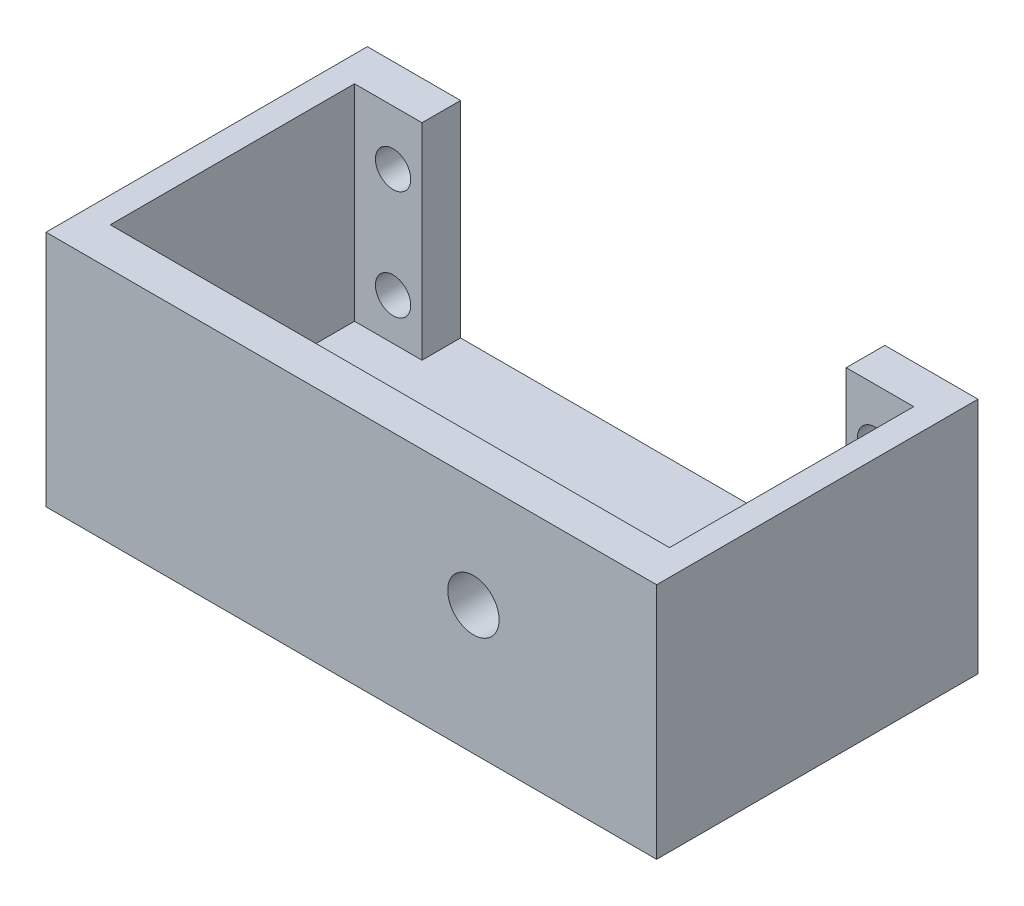
ISO-10303-21;
HEADER;
FILE_DESCRIPTION(('STEP AP214'),'2;1');
FILE_NAME('part.step','',(''),(''),'','','');
FILE_SCHEMA(('AUTOMOTIVE_DESIGN { 1 0 10303 214 1 1 1 1 }'));
ENDSEC;
DATA;
#1=APPLICATION_CONTEXT('core data for automotive mechanical design processes');
#2=APPLICATION_PROTOCOL_DEFINITION('international standard','automotive_design',2000,#1);
#3=PRODUCT_CONTEXT('',#1,'mechanical');
#4=PRODUCT('Part','Part','',(#3));
#5=PRODUCT_RELATED_PRODUCT_CATEGORY('part','',(#4));
#6=PRODUCT_DEFINITION_FORMATION('','',#4);
#7=PRODUCT_DEFINITION_CONTEXT('part definition',#1,'design');
#8=PRODUCT_DEFINITION('design','',#6,#7);
#9=PRODUCT_DEFINITION_SHAPE('','',#8);
#10=(LENGTH_UNIT() NAMED_UNIT(*) SI_UNIT(.MILLI.,.METRE.));
#11=(NAMED_UNIT(*) PLANE_ANGLE_UNIT() SI_UNIT($,.RADIAN.));
#12=(NAMED_UNIT(*) SI_UNIT($,.STERADIAN.) SOLID_ANGLE_UNIT());
#13=UNCERTAINTY_MEASURE_WITH_UNIT(LENGTH_MEASURE(1.E-05),#10,'distance_accuracy_value','');
#14=(GEOMETRIC_REPRESENTATION_CONTEXT(3) GLOBAL_UNCERTAINTY_ASSIGNED_CONTEXT((#13)) GLOBAL_UNIT_ASSIGNED_CONTEXT((#10,
#11,#12)) REPRESENTATION_CONTEXT('',''));
#15=CARTESIAN_POINT('',(0.,0.,0.));
#16=DIRECTION('',(0.,0.,1.));
#17=DIRECTION('',(1.,0.,0.));
#18=AXIS2_PLACEMENT_3D('',#15,#16,#17);
#19=CARTESIAN_POINT('',(-33.,37.,-19.));
#20=DIRECTION('',(0.,0.,-1.));
#21=DIRECTION('',(-1.,0.,0.));
#22=AXIS2_PLACEMENT_3D('',#19,#20,#21);
#23=PLANE('',#22);
#24=CARTESIAN_POINT('',(-37.5,11.5,-19.));
#25=DIRECTION('',(0.,0.,-1.));
#26=DIRECTION('',(-1.,0.,0.));
#27=AXIS2_PLACEMENT_3D('',#24,#25,#26);
#28=CIRCLE('',#27,2.75);
#29=CARTESIAN_POINT('',(-40.25,11.5,-19.));
#30=VERTEX_POINT('',#29);
#31=EDGE_CURVE('E203',#30,#30,#28,.T.);
#32=ORIENTED_EDGE('',*,*,#31,.T.);
#33=EDGE_LOOP('',(#32));
#34=FACE_BOUND('',#33,.T.);
#35=CARTESIAN_POINT('',(-37.5,28.5,-19.));
#36=DIRECTION('',(0.,0.,-1.));
#37=DIRECTION('',(-1.,0.,0.));
#38=AXIS2_PLACEMENT_3D('',#35,#36,#37);
#39=CIRCLE('',#38,2.75);
#40=CARTESIAN_POINT('',(-40.25,28.5,-19.));
#41=VERTEX_POINT('',#40);
#42=EDGE_CURVE('E184',#41,#41,#39,.T.);
#43=ORIENTED_EDGE('',*,*,#42,.T.);
#44=EDGE_LOOP('',(#43));
#45=FACE_BOUND('',#44,.T.);
#46=DIRECTION('',(0.,-1.,0.));
#47=VECTOR('',#46,1.);
#48=CARTESIAN_POINT('',(-43.5,37.,-19.));
#49=LINE('',#48,#47);
#50=CARTESIAN_POINT('',(-43.5,37.,-19.));
#51=VERTEX_POINT('',#50);
#52=CARTESIAN_POINT('',(-43.5,5.,-19.));
#53=VERTEX_POINT('',#52);
#54=EDGE_CURVE('E174',#51,#53,#49,.T.);
#55=ORIENTED_EDGE('',*,*,#54,.T.);
#56=DIRECTION('',(1.,0.,0.));
#57=VECTOR('',#56,1.);
#58=CARTESIAN_POINT('',(-33.,5.,-19.));
#59=LINE('',#58,#57);
#60=CARTESIAN_POINT('',(-33.,5.,-19.));
#61=VERTEX_POINT('',#60);
#62=EDGE_CURVE('E229',#53,#61,#59,.T.);
#63=ORIENTED_EDGE('',*,*,#62,.T.);
#64=DIRECTION('',(0.,-1.,0.));
#65=VECTOR('',#64,1.);
#66=CARTESIAN_POINT('',(-33.,37.,-19.));
#67=LINE('',#66,#65);
#68=CARTESIAN_POINT('',(-33.,37.,-19.));
#69=VERTEX_POINT('',#68);
#70=EDGE_CURVE('E237',#69,#61,#67,.T.);
#71=ORIENTED_EDGE('',*,*,#70,.F.);
#72=DIRECTION('',(1.,0.,0.));
#73=VECTOR('',#72,1.);
#74=CARTESIAN_POINT('',(-33.,37.,-19.));
#75=LINE('',#74,#73);
#76=EDGE_CURVE('E235',#51,#69,#75,.T.);
#77=ORIENTED_EDGE('',*,*,#76,.F.);
#78=EDGE_LOOP('',(#55,#63,#71,#77));
#79=FACE_BOUND('',#78,.T.);
#80=ADVANCED_FACE('F43',(#34,#45,#79),#23,.F.);
#81=CARTESIAN_POINT('',(0.,5.,0.));
#82=DIRECTION('',(0.,1.,0.));
#83=DIRECTION('',(0.,0.,1.));
#84=AXIS2_PLACEMENT_3D('',#81,#82,#83);
#85=PLANE('',#84);
#86=DIRECTION('',(0.,0.,-1.));
#87=VECTOR('',#86,1.);
#88=CARTESIAN_POINT('',(43.5,5.,0.));
#89=LINE('',#88,#87);
#90=CARTESIAN_POINT('',(43.5,5.,19.));
#91=VERTEX_POINT('',#90);
#92=CARTESIAN_POINT('',(43.5,5.,-19.));
#93=VERTEX_POINT('',#92);
#94=EDGE_CURVE('E139',#91,#93,#89,.T.);
#95=ORIENTED_EDGE('',*,*,#94,.T.);
#96=DIRECTION('',(1.,0.,0.));
#97=VECTOR('',#96,1.);
#98=CARTESIAN_POINT('',(33.,5.,-19.));
#99=LINE('',#98,#97);
#100=CARTESIAN_POINT('',(33.,5.,-19.));
#101=VERTEX_POINT('',#100);
#102=EDGE_CURVE('E60',#101,#93,#99,.T.);
#103=ORIENTED_EDGE('',*,*,#102,.F.);
#104=DIRECTION('',(0.,0.,1.));
#105=VECTOR('',#104,1.);
#106=CARTESIAN_POINT('',(33.,5.,-25.));
#107=LINE('',#106,#105);
#108=CARTESIAN_POINT('',(33.,5.,-25.));
#109=VERTEX_POINT('',#108);
#110=EDGE_CURVE('E206',#109,#101,#107,.T.);
#111=ORIENTED_EDGE('',*,*,#110,.F.);
#112=DIRECTION('',(-1.,0.,0.));
#113=VECTOR('',#112,1.);
#114=CARTESIAN_POINT('',(-47.5,5.,-25.));
#115=LINE('',#114,#113);
#116=CARTESIAN_POINT('',(-33.,5.,-25.));
#117=VERTEX_POINT('',#116);
#118=EDGE_CURVE('E66',#109,#117,#115,.T.);
#119=ORIENTED_EDGE('',*,*,#118,.T.);
#120=DIRECTION('',(0.,0.,-1.));
#121=VECTOR('',#120,1.);
#122=CARTESIAN_POINT('',(-33.,5.,-25.));
#123=LINE('',#122,#121);
#124=EDGE_CURVE('E225',#61,#117,#123,.T.);
#125=ORIENTED_EDGE('',*,*,#124,.F.);
#126=ORIENTED_EDGE('',*,*,#62,.F.);
#127=DIRECTION('',(0.,0.,-1.));
#128=VECTOR('',#127,1.);
#129=CARTESIAN_POINT('',(-43.5,5.,0.));
#130=LINE('',#129,#128);
#131=CARTESIAN_POINT('',(-43.5,5.,19.));
#132=VERTEX_POINT('',#131);
#133=EDGE_CURVE('E155',#132,#53,#130,.T.);
#134=ORIENTED_EDGE('',*,*,#133,.F.);
#135=DIRECTION('',(1.,0.,0.));
#136=VECTOR('',#135,1.);
#137=CARTESIAN_POINT('',(0.,5.,19.));
#138=LINE('',#137,#136);
#139=EDGE_CURVE('E169',#132,#91,#138,.T.);
#140=ORIENTED_EDGE('',*,*,#139,.T.);
#141=EDGE_LOOP('',(#95,#103,#111,#119,#125,#126,#134,#140));
#142=FACE_BOUND('',#141,.T.);
#143=CARTESIAN_POINT('',(-38.,5.,0.));
#144=DIRECTION('',(0.,1.,0.));
#145=DIRECTION('',(0.,0.,1.));
#146=AXIS2_PLACEMENT_3D('',#143,#144,#145);
#147=CIRCLE('',#146,2.7);
#148=CARTESIAN_POINT('',(-38.,5.,2.7));
#149=VERTEX_POINT('',#148);
#150=EDGE_CURVE('E178',#149,#149,#147,.T.);
#151=ORIENTED_EDGE('',*,*,#150,.F.);
#152=EDGE_LOOP('',(#151));
#153=FACE_BOUND('',#152,.T.);
#154=CARTESIAN_POINT('',(38.,5.,0.));
#155=DIRECTION('',(0.,1.,0.));
#156=DIRECTION('',(0.,0.,-1.));
#157=AXIS2_PLACEMENT_3D('',#154,#155,#156);
#158=CIRCLE('',#157,2.7);
#159=CARTESIAN_POINT('',(38.,5.,-2.70000000000001));
#160=VERTEX_POINT('',#159);
#161=EDGE_CURVE('E144',#160,#160,#158,.T.);
#162=ORIENTED_EDGE('',*,*,#161,.F.);
#163=EDGE_LOOP('',(#162));
#164=FACE_BOUND('',#163,.T.);
#165=ADVANCED_FACE('F284',(#142,#153,#164),#85,.T.);
#166=CARTESIAN_POINT('',(47.5,5.,-25.));
#167=DIRECTION('',(-1.,0.,0.));
#168=DIRECTION('',(0.,0.,1.));
#169=AXIS2_PLACEMENT_3D('',#166,#167,#168);
#170=PLANE('',#169);
#171=DIRECTION('',(0.,0.,-1.));
#172=VECTOR('',#171,1.);
#173=CARTESIAN_POINT('',(47.5,0.,-25.));
#174=LINE('',#173,#172);
#175=CARTESIAN_POINT('',(47.5,0.,25.));
#176=VERTEX_POINT('',#175);
#177=CARTESIAN_POINT('',(47.5,0.,-25.));
#178=VERTEX_POINT('',#177);
#179=EDGE_CURVE('E245',#176,#178,#174,.T.);
#180=ORIENTED_EDGE('',*,*,#179,.T.);
#181=DIRECTION('',(0.,-1.,0.));
#182=VECTOR('',#181,1.);
#183=CARTESIAN_POINT('',(47.5,5.,-25.));
#184=LINE('',#183,#182);
#185=CARTESIAN_POINT('',(47.5,37.,-25.));
#186=VERTEX_POINT('',#185);
#187=EDGE_CURVE('E11',#186,#178,#184,.T.);
#188=ORIENTED_EDGE('',*,*,#187,.F.);
#189=DIRECTION('',(0.,0.,-1.));
#190=VECTOR('',#189,1.);
#191=CARTESIAN_POINT('',(47.5,37.,-25.));
#192=LINE('',#191,#190);
#193=CARTESIAN_POINT('',(47.5,37.,25.));
#194=VERTEX_POINT('',#193);
#195=EDGE_CURVE('E212',#194,#186,#192,.T.);
#196=ORIENTED_EDGE('',*,*,#195,.F.);
#197=DIRECTION('',(0.,-1.,0.));
#198=VECTOR('',#197,1.);
#199=CARTESIAN_POINT('',(47.5,5.,25.));
#200=LINE('',#199,#198);
#201=EDGE_CURVE('E247',#194,#176,#200,.T.);
#202=ORIENTED_EDGE('',*,*,#201,.T.);
#203=EDGE_LOOP('',(#180,#188,#196,#202));
#204=FACE_BOUND('',#203,.T.);
#205=ADVANCED_FACE('F45',(#204),#170,.F.);
#206=CARTESIAN_POINT('',(-47.5,5.,-25.));
#207=DIRECTION('',(0.,0.,1.));
#208=DIRECTION('',(1.,0.,0.));
#209=AXIS2_PLACEMENT_3D('',#206,#207,#208);
#210=PLANE('',#209);
#211=CARTESIAN_POINT('',(37.5,11.5,-25.));
#212=DIRECTION('',(0.,0.,-1.));
#213=DIRECTION('',(1.,0.,0.));
#214=AXIS2_PLACEMENT_3D('',#211,#212,#213);
#215=CIRCLE('',#214,2.75);
#216=CARTESIAN_POINT('',(40.25,11.5,-25.));
#217=VERTEX_POINT('',#216);
#218=EDGE_CURVE('E200',#217,#217,#215,.T.);
#219=ORIENTED_EDGE('',*,*,#218,.F.);
#220=EDGE_LOOP('',(#219));
#221=FACE_BOUND('',#220,.T.);
#222=CARTESIAN_POINT('',(37.5,28.5,-25.));
#223=DIRECTION('',(0.,0.,-1.));
#224=DIRECTION('',(1.,0.,0.));
#225=AXIS2_PLACEMENT_3D('',#222,#223,#224);
#226=CIRCLE('',#225,2.75);
#227=CARTESIAN_POINT('',(40.25,28.5,-25.));
#228=VERTEX_POINT('',#227);
#229=EDGE_CURVE('E194',#228,#228,#226,.T.);
#230=ORIENTED_EDGE('',*,*,#229,.F.);
#231=EDGE_LOOP('',(#230));
#232=FACE_BOUND('',#231,.T.);
#233=CARTESIAN_POINT('',(-37.5,28.5,-25.));
#234=DIRECTION('',(0.,0.,-1.));
#235=DIRECTION('',(-1.,0.,0.));
#236=AXIS2_PLACEMENT_3D('',#233,#234,#235);
#237=CIRCLE('',#236,2.75);
#238=CARTESIAN_POINT('',(-40.25,28.5,-25.));
#239=VERTEX_POINT('',#238);
#240=EDGE_CURVE('E188',#239,#239,#237,.T.);
#241=ORIENTED_EDGE('',*,*,#240,.F.);
#242=EDGE_LOOP('',(#241));
#243=FACE_BOUND('',#242,.T.);
#244=CARTESIAN_POINT('',(-37.5,11.5,-25.));
#245=DIRECTION('',(0.,0.,-1.));
#246=DIRECTION('',(-1.,0.,0.));
#247=AXIS2_PLACEMENT_3D('',#244,#245,#246);
#248=CIRCLE('',#247,2.75);
#249=CARTESIAN_POINT('',(-40.25,11.5,-25.));
#250=VERTEX_POINT('',#249);
#251=EDGE_CURVE('E187',#250,#250,#248,.T.);
#252=ORIENTED_EDGE('',*,*,#251,.F.);
#253=EDGE_LOOP('',(#252));
#254=FACE_BOUND('',#253,.T.);
#255=DIRECTION('',(-1.,0.,0.));
#256=VECTOR('',#255,1.);
#257=CARTESIAN_POINT('',(-47.5,0.,-25.));
#258=LINE('',#257,#256);
#259=CARTESIAN_POINT('',(-47.5,0.,-25.));
#260=VERTEX_POINT('',#259);
#261=EDGE_CURVE('E251',#178,#260,#258,.T.);
#262=ORIENTED_EDGE('',*,*,#261,.T.);
#263=DIRECTION('',(0.,-1.,0.));
#264=VECTOR('',#263,1.);
#265=CARTESIAN_POINT('',(-47.5,5.,-25.));
#266=LINE('',#265,#264);
#267=CARTESIAN_POINT('',(-47.5,37.,-25.));
#268=VERTEX_POINT('',#267);
#269=EDGE_CURVE('E52',#268,#260,#266,.T.);
#270=ORIENTED_EDGE('',*,*,#269,.F.);
#271=DIRECTION('',(-1.,0.,0.));
#272=VECTOR('',#271,1.);
#273=CARTESIAN_POINT('',(-33.,37.,-25.));
#274=LINE('',#273,#272);
#275=CARTESIAN_POINT('',(-33.,37.,-25.));
#276=VERTEX_POINT('',#275);
#277=EDGE_CURVE('E228',#276,#268,#274,.T.);
#278=ORIENTED_EDGE('',*,*,#277,.F.);
#279=DIRECTION('',(0.,-1.,0.));
#280=VECTOR('',#279,1.);
#281=CARTESIAN_POINT('',(-33.,37.,-25.));
#282=LINE('',#281,#280);
#283=EDGE_CURVE('E243',#276,#117,#282,.T.);
#284=ORIENTED_EDGE('',*,*,#283,.T.);
#285=ORIENTED_EDGE('',*,*,#118,.F.);
#286=DIRECTION('',(0.,-1.,0.));
#287=VECTOR('',#286,1.);
#288=CARTESIAN_POINT('',(33.,37.,-25.));
#289=LINE('',#288,#287);
#290=CARTESIAN_POINT('',(33.,37.,-25.));
#291=VERTEX_POINT('',#290);
#292=EDGE_CURVE('E217',#291,#109,#289,.T.);
#293=ORIENTED_EDGE('',*,*,#292,.F.);
#294=DIRECTION('',(-1.,0.,0.));
#295=VECTOR('',#294,1.);
#296=CARTESIAN_POINT('',(33.,37.,-25.));
#297=LINE('',#296,#295);
#298=EDGE_CURVE('E215',#186,#291,#297,.T.);
#299=ORIENTED_EDGE('',*,*,#298,.F.);
#300=ORIENTED_EDGE('',*,*,#187,.T.);
#301=EDGE_LOOP('',(#262,#270,#278,#284,#285,#293,#299,#300));
#302=FACE_BOUND('',#301,.T.);
#303=ADVANCED_FACE('F307',(#221,#232,#243,#254,#302),#210,.F.);
#304=CARTESIAN_POINT('',(-47.5,5.,-25.));
#305=DIRECTION('',(1.,0.,0.));
#306=DIRECTION('',(0.,0.,-1.));
#307=AXIS2_PLACEMENT_3D('',#304,#305,#306);
#308=PLANE('',#307);
#309=DIRECTION('',(0.,-1.,0.));
#310=VECTOR('',#309,1.);
#311=CARTESIAN_POINT('',(-47.5,5.,25.));
#312=LINE('',#311,#310);
#313=CARTESIAN_POINT('',(-47.5,37.,25.));
#314=VERTEX_POINT('',#313);
#315=CARTESIAN_POINT('',(-47.5,0.,25.));
#316=VERTEX_POINT('',#315);
#317=EDGE_CURVE('E258',#314,#316,#312,.T.);
#318=ORIENTED_EDGE('',*,*,#317,.F.);
#319=DIRECTION('',(0.,0.,1.));
#320=VECTOR('',#319,1.);
#321=CARTESIAN_POINT('',(-47.5,37.,-25.));
#322=LINE('',#321,#320);
#323=EDGE_CURVE('E232',#268,#314,#322,.T.);
#324=ORIENTED_EDGE('',*,*,#323,.F.);
#325=ORIENTED_EDGE('',*,*,#269,.T.);
#326=DIRECTION('',(0.,0.,1.));
#327=VECTOR('',#326,1.);
#328=CARTESIAN_POINT('',(-47.5,0.,-25.));
#329=LINE('',#328,#327);
#330=EDGE_CURVE('E253',#260,#316,#329,.T.);
#331=ORIENTED_EDGE('',*,*,#330,.T.);
#332=EDGE_LOOP('',(#318,#324,#325,#331));
#333=FACE_BOUND('',#332,.T.);
#334=ADVANCED_FACE('F304',(#333),#308,.F.);
#335=CARTESIAN_POINT('',(-47.5,5.,25.));
#336=DIRECTION('',(0.,0.,-1.));
#337=DIRECTION('',(-1.,0.,0.));
#338=AXIS2_PLACEMENT_3D('',#335,#336,#337);
#339=PLANE('',#338);
#340=CARTESIAN_POINT('',(19.,20.,25.));
#341=DIRECTION('',(0.,0.,1.));
#342=DIRECTION('',(1.,0.,0.));
#343=AXIS2_PLACEMENT_3D('',#340,#341,#342);
#344=CIRCLE('',#343,4.);
#345=CARTESIAN_POINT('',(23.,20.,25.));
#346=VERTEX_POINT('',#345);
#347=EDGE_CURVE('E482',#346,#346,#344,.T.);
#348=ORIENTED_EDGE('',*,*,#347,.F.);
#349=EDGE_LOOP('',(#348));
#350=FACE_BOUND('',#349,.T.);
#351=DIRECTION('',(1.,0.,0.));
#352=VECTOR('',#351,1.);
#353=CARTESIAN_POINT('',(-47.5,0.,25.));
#354=LINE('',#353,#352);
#355=EDGE_CURVE('E248',#316,#176,#354,.T.);
#356=ORIENTED_EDGE('',*,*,#355,.T.);
#357=ORIENTED_EDGE('',*,*,#201,.F.);
#358=DIRECTION('',(1.,0.,0.));
#359=VECTOR('',#358,1.);
#360=CARTESIAN_POINT('',(0.,37.,25.));
#361=LINE('',#360,#359);
#362=EDGE_CURVE('E161',#314,#194,#361,.T.);
#363=ORIENTED_EDGE('',*,*,#362,.F.);
#364=ORIENTED_EDGE('',*,*,#317,.T.);
#365=EDGE_LOOP('',(#356,#357,#363,#364));
#366=FACE_BOUND('',#365,.T.);
#367=ADVANCED_FACE('F301',(#350,#366),#339,.F.);
#368=CARTESIAN_POINT('',(0.,0.,0.));
#369=DIRECTION('',(0.,1.,0.));
#370=DIRECTION('',(0.,0.,1.));
#371=AXIS2_PLACEMENT_3D('',#368,#369,#370);
#372=PLANE('',#371);
#373=CARTESIAN_POINT('',(-38.,0.,0.));
#374=DIRECTION('',(0.,1.,0.));
#375=DIRECTION('',(0.,0.,1.));
#376=AXIS2_PLACEMENT_3D('',#373,#374,#375);
#377=CIRCLE('',#376,2.7);
#378=CARTESIAN_POINT('',(-38.,0.,2.7));
#379=VERTEX_POINT('',#378);
#380=EDGE_CURVE('E47',#379,#379,#377,.T.);
#381=ORIENTED_EDGE('',*,*,#380,.T.);
#382=EDGE_LOOP('',(#381));
#383=FACE_BOUND('',#382,.T.);
#384=CARTESIAN_POINT('',(38.,0.,0.));
#385=DIRECTION('',(0.,1.,0.));
#386=DIRECTION('',(0.,0.,1.));
#387=AXIS2_PLACEMENT_3D('',#384,#385,#386);
#388=CIRCLE('',#387,2.7);
#389=CARTESIAN_POINT('',(38.,0.,2.69999999999999));
#390=VERTEX_POINT('',#389);
#391=EDGE_CURVE('E181',#390,#390,#388,.T.);
#392=ORIENTED_EDGE('',*,*,#391,.T.);
#393=EDGE_LOOP('',(#392));
#394=FACE_BOUND('',#393,.T.);
#395=ORIENTED_EDGE('',*,*,#179,.F.);
#396=ORIENTED_EDGE('',*,*,#355,.F.);
#397=ORIENTED_EDGE('',*,*,#330,.F.);
#398=ORIENTED_EDGE('',*,*,#261,.F.);
#399=EDGE_LOOP('',(#395,#396,#397,#398));
#400=FACE_BOUND('',#399,.T.);
#401=ADVANCED_FACE('F268',(#383,#394,#400),#372,.F.);
#402=CARTESIAN_POINT('',(-33.,37.,-25.));
#403=DIRECTION('',(-1.,0.,0.));
#404=DIRECTION('',(0.,0.,1.));
#405=AXIS2_PLACEMENT_3D('',#402,#403,#404);
#406=PLANE('',#405);
#407=ORIENTED_EDGE('',*,*,#124,.T.);
#408=ORIENTED_EDGE('',*,*,#283,.F.);
#409=DIRECTION('',(0.,0.,-1.));
#410=VECTOR('',#409,1.);
#411=CARTESIAN_POINT('',(-33.,37.,-25.));
#412=LINE('',#411,#410);
#413=EDGE_CURVE('E226',#69,#276,#412,.T.);
#414=ORIENTED_EDGE('',*,*,#413,.F.);
#415=ORIENTED_EDGE('',*,*,#70,.T.);
#416=EDGE_LOOP('',(#407,#408,#414,#415));
#417=FACE_BOUND('',#416,.T.);
#418=ADVANCED_FACE('F295',(#417),#406,.F.);
#419=CARTESIAN_POINT('',(0.,37.,0.));
#420=DIRECTION('',(0.,-1.,0.));
#421=DIRECTION('',(0.,0.,-1.));
#422=AXIS2_PLACEMENT_3D('',#419,#420,#421);
#423=PLANE('',#422);
#424=ORIENTED_EDGE('',*,*,#413,.T.);
#425=ORIENTED_EDGE('',*,*,#277,.T.);
#426=ORIENTED_EDGE('',*,*,#323,.T.);
#427=ORIENTED_EDGE('',*,*,#362,.T.);
#428=ORIENTED_EDGE('',*,*,#195,.T.);
#429=ORIENTED_EDGE('',*,*,#298,.T.);
#430=DIRECTION('',(0.,0.,1.));
#431=VECTOR('',#430,1.);
#432=CARTESIAN_POINT('',(33.,37.,-25.));
#433=LINE('',#432,#431);
#434=CARTESIAN_POINT('',(33.,37.,-19.));
#435=VERTEX_POINT('',#434);
#436=EDGE_CURVE('E209',#291,#435,#433,.T.);
#437=ORIENTED_EDGE('',*,*,#436,.T.);
#438=DIRECTION('',(1.,0.,0.));
#439=VECTOR('',#438,1.);
#440=CARTESIAN_POINT('',(33.,37.,-19.));
#441=LINE('',#440,#439);
#442=CARTESIAN_POINT('',(43.5,37.,-19.));
#443=VERTEX_POINT('',#442);
#444=EDGE_CURVE('E154',#435,#443,#441,.T.);
#445=ORIENTED_EDGE('',*,*,#444,.T.);
#446=DIRECTION('',(0.,0.,-1.));
#447=VECTOR('',#446,1.);
#448=CARTESIAN_POINT('',(43.5,37.,0.));
#449=LINE('',#448,#447);
#450=CARTESIAN_POINT('',(43.5,37.,19.));
#451=VERTEX_POINT('',#450);
#452=EDGE_CURVE('E137',#451,#443,#449,.T.);
#453=ORIENTED_EDGE('',*,*,#452,.F.);
#454=DIRECTION('',(1.,0.,0.));
#455=VECTOR('',#454,1.);
#456=CARTESIAN_POINT('',(0.,37.,19.));
#457=LINE('',#456,#455);
#458=CARTESIAN_POINT('',(-43.5,37.,19.));
#459=VERTEX_POINT('',#458);
#460=EDGE_CURVE('E152',#459,#451,#457,.T.);
#461=ORIENTED_EDGE('',*,*,#460,.F.);
#462=DIRECTION('',(0.,0.,-1.));
#463=VECTOR('',#462,1.);
#464=CARTESIAN_POINT('',(-43.5,37.,0.));
#465=LINE('',#464,#463);
#466=EDGE_CURVE('E159',#459,#51,#465,.T.);
#467=ORIENTED_EDGE('',*,*,#466,.T.);
#468=ORIENTED_EDGE('',*,*,#76,.T.);
#469=EDGE_LOOP('',(#424,#425,#426,#427,#428,#429,#437,#445,#453,#461,#467,#468));
#470=FACE_BOUND('',#469,.T.);
#471=ADVANCED_FACE('F151',(#470),#423,.F.);
#472=CARTESIAN_POINT('',(33.,37.,-25.));
#473=DIRECTION('',(1.,0.,0.));
#474=DIRECTION('',(0.,0.,-1.));
#475=AXIS2_PLACEMENT_3D('',#472,#473,#474);
#476=PLANE('',#475);
#477=ORIENTED_EDGE('',*,*,#110,.T.);
#478=DIRECTION('',(0.,-1.,0.));
#479=VECTOR('',#478,1.);
#480=CARTESIAN_POINT('',(33.,37.,-19.));
#481=LINE('',#480,#479);
#482=EDGE_CURVE('E223',#435,#101,#481,.T.);
#483=ORIENTED_EDGE('',*,*,#482,.F.);
#484=ORIENTED_EDGE('',*,*,#436,.F.);
#485=ORIENTED_EDGE('',*,*,#292,.T.);
#486=EDGE_LOOP('',(#477,#483,#484,#485));
#487=FACE_BOUND('',#486,.T.);
#488=ADVANCED_FACE('F349',(#487),#476,.F.);
#489=CARTESIAN_POINT('',(33.,37.,-19.));
#490=DIRECTION('',(0.,0.,-1.));
#491=DIRECTION('',(-1.,0.,0.));
#492=AXIS2_PLACEMENT_3D('',#489,#490,#491);
#493=PLANE('',#492);
#494=CARTESIAN_POINT('',(37.5,11.5,-19.));
#495=DIRECTION('',(0.,0.,-1.));
#496=DIRECTION('',(1.,0.,0.));
#497=AXIS2_PLACEMENT_3D('',#494,#495,#496);
#498=CIRCLE('',#497,2.75);
#499=CARTESIAN_POINT('',(40.25,11.5,-19.));
#500=VERTEX_POINT('',#499);
#501=EDGE_CURVE('E197',#500,#500,#498,.T.);
#502=ORIENTED_EDGE('',*,*,#501,.T.);
#503=EDGE_LOOP('',(#502));
#504=FACE_BOUND('',#503,.T.);
#505=CARTESIAN_POINT('',(37.5,28.5,-19.));
#506=DIRECTION('',(0.,0.,-1.));
#507=DIRECTION('',(1.,0.,0.));
#508=AXIS2_PLACEMENT_3D('',#505,#506,#507);
#509=CIRCLE('',#508,2.75);
#510=CARTESIAN_POINT('',(40.25,28.5,-19.));
#511=VERTEX_POINT('',#510);
#512=EDGE_CURVE('E191',#511,#511,#509,.T.);
#513=ORIENTED_EDGE('',*,*,#512,.T.);
#514=EDGE_LOOP('',(#513));
#515=FACE_BOUND('',#514,.T.);
#516=ORIENTED_EDGE('',*,*,#102,.T.);
#517=DIRECTION('',(0.,-1.,0.));
#518=VECTOR('',#517,1.);
#519=CARTESIAN_POINT('',(43.5,37.,-19.));
#520=LINE('',#519,#518);
#521=EDGE_CURVE('E167',#443,#93,#520,.T.);
#522=ORIENTED_EDGE('',*,*,#521,.F.);
#523=ORIENTED_EDGE('',*,*,#444,.F.);
#524=ORIENTED_EDGE('',*,*,#482,.T.);
#525=EDGE_LOOP('',(#516,#522,#523,#524));
#526=FACE_BOUND('',#525,.T.);
#527=ADVANCED_FACE('F345',(#504,#515,#526),#493,.F.);
#528=CARTESIAN_POINT('',(37.5,28.5,-19.));
#529=DIRECTION('',(0.,0.,-1.));
#530=DIRECTION('',(-1.,0.,0.));
#531=AXIS2_PLACEMENT_3D('',#528,#529,#530);
#532=CYLINDRICAL_SURFACE('',#531,2.75);
#533=ORIENTED_EDGE('',*,*,#512,.F.);
#534=EDGE_LOOP('',(#533));
#535=FACE_BOUND('',#534,.T.);
#536=ORIENTED_EDGE('',*,*,#229,.T.);
#537=EDGE_LOOP('',(#536));
#538=FACE_BOUND('',#537,.T.);
#539=ADVANCED_FACE('F355',(#535,#538),#532,.F.);
#540=CARTESIAN_POINT('',(37.5,11.5,-19.));
#541=DIRECTION('',(0.,0.,-1.));
#542=DIRECTION('',(-1.,0.,0.));
#543=AXIS2_PLACEMENT_3D('',#540,#541,#542);
#544=CYLINDRICAL_SURFACE('',#543,2.75);
#545=ORIENTED_EDGE('',*,*,#501,.F.);
#546=EDGE_LOOP('',(#545));
#547=FACE_BOUND('',#546,.T.);
#548=ORIENTED_EDGE('',*,*,#218,.T.);
#549=EDGE_LOOP('',(#548));
#550=FACE_BOUND('',#549,.T.);
#551=ADVANCED_FACE('F362',(#547,#550),#544,.F.);
#552=CARTESIAN_POINT('',(-37.5,11.5,-19.));
#553=DIRECTION('',(0.,0.,-1.));
#554=DIRECTION('',(-1.,0.,0.));
#555=AXIS2_PLACEMENT_3D('',#552,#553,#554);
#556=CYLINDRICAL_SURFACE('',#555,2.75);
#557=ORIENTED_EDGE('',*,*,#31,.F.);
#558=EDGE_LOOP('',(#557));
#559=FACE_BOUND('',#558,.T.);
#560=ORIENTED_EDGE('',*,*,#251,.T.);
#561=EDGE_LOOP('',(#560));
#562=FACE_BOUND('',#561,.T.);
#563=ADVANCED_FACE('F359',(#559,#562),#556,.F.);
#564=CARTESIAN_POINT('',(-37.5,28.5,-19.));
#565=DIRECTION('',(0.,0.,-1.));
#566=DIRECTION('',(-1.,0.,0.));
#567=AXIS2_PLACEMENT_3D('',#564,#565,#566);
#568=CYLINDRICAL_SURFACE('',#567,2.75);
#569=ORIENTED_EDGE('',*,*,#42,.F.);
#570=EDGE_LOOP('',(#569));
#571=FACE_BOUND('',#570,.T.);
#572=ORIENTED_EDGE('',*,*,#240,.T.);
#573=EDGE_LOOP('',(#572));
#574=FACE_BOUND('',#573,.T.);
#575=ADVANCED_FACE('F280',(#571,#574),#568,.F.);
#576=CARTESIAN_POINT('',(38.,-1.,0.));
#577=DIRECTION('',(0.,1.,0.));
#578=DIRECTION('',(0.,0.,1.));
#579=AXIS2_PLACEMENT_3D('',#576,#577,#578);
#580=CYLINDRICAL_SURFACE('',#579,2.7);
#581=ORIENTED_EDGE('',*,*,#161,.T.);
#582=EDGE_LOOP('',(#581));
#583=FACE_BOUND('',#582,.T.);
#584=ORIENTED_EDGE('',*,*,#391,.F.);
#585=EDGE_LOOP('',(#584));
#586=FACE_BOUND('',#585,.T.);
#587=ADVANCED_FACE('F272',(#583,#586),#580,.F.);
#588=CARTESIAN_POINT('',(-38.,-1.,0.));
#589=DIRECTION('',(0.,1.,0.));
#590=DIRECTION('',(0.,0.,1.));
#591=AXIS2_PLACEMENT_3D('',#588,#589,#590);
#592=CYLINDRICAL_SURFACE('',#591,2.7);
#593=ORIENTED_EDGE('',*,*,#150,.T.);
#594=EDGE_LOOP('',(#593));
#595=FACE_BOUND('',#594,.T.);
#596=ORIENTED_EDGE('',*,*,#380,.F.);
#597=EDGE_LOOP('',(#596));
#598=FACE_BOUND('',#597,.T.);
#599=ADVANCED_FACE('F270',(#595,#598),#592,.F.);
#600=CARTESIAN_POINT('',(43.5,37.,0.));
#601=DIRECTION('',(-1.,0.,0.));
#602=DIRECTION('',(0.,0.,1.));
#603=AXIS2_PLACEMENT_3D('',#600,#601,#602);
#604=PLANE('',#603);
#605=ORIENTED_EDGE('',*,*,#94,.F.);
#606=DIRECTION('',(0.,-1.,0.));
#607=VECTOR('',#606,1.);
#608=CARTESIAN_POINT('',(43.5,37.,19.));
#609=LINE('',#608,#607);
#610=EDGE_CURVE('E134',#451,#91,#609,.T.);
#611=ORIENTED_EDGE('',*,*,#610,.F.);
#612=ORIENTED_EDGE('',*,*,#452,.T.);
#613=ORIENTED_EDGE('',*,*,#521,.T.);
#614=EDGE_LOOP('',(#605,#611,#612,#613));
#615=FACE_BOUND('',#614,.T.);
#616=ADVANCED_FACE('F136',(#615),#604,.T.);
#617=CARTESIAN_POINT('',(0.,37.,19.));
#618=DIRECTION('',(0.,0.,-1.));
#619=DIRECTION('',(-1.,0.,0.));
#620=AXIS2_PLACEMENT_3D('',#617,#618,#619);
#621=PLANE('',#620);
#622=CARTESIAN_POINT('',(19.,20.,19.));
#623=DIRECTION('',(0.,0.,1.));
#624=DIRECTION('',(1.,0.,0.));
#625=AXIS2_PLACEMENT_3D('',#622,#623,#624);
#626=CIRCLE('',#625,4.);
#627=CARTESIAN_POINT('',(23.,20.,19.));
#628=VERTEX_POINT('',#627);
#629=EDGE_CURVE('E170',#628,#628,#626,.T.);
#630=ORIENTED_EDGE('',*,*,#629,.T.);
#631=EDGE_LOOP('',(#630));
#632=FACE_BOUND('',#631,.T.);
#633=ORIENTED_EDGE('',*,*,#139,.F.);
#634=DIRECTION('',(0.,-1.,0.));
#635=VECTOR('',#634,1.);
#636=CARTESIAN_POINT('',(-43.5,37.,19.));
#637=LINE('',#636,#635);
#638=EDGE_CURVE('E145',#459,#132,#637,.T.);
#639=ORIENTED_EDGE('',*,*,#638,.F.);
#640=ORIENTED_EDGE('',*,*,#460,.T.);
#641=ORIENTED_EDGE('',*,*,#610,.T.);
#642=EDGE_LOOP('',(#633,#639,#640,#641));
#643=FACE_BOUND('',#642,.T.);
#644=ADVANCED_FACE('F157',(#632,#643),#621,.T.);
#645=CARTESIAN_POINT('',(-43.5,37.,0.));
#646=DIRECTION('',(-1.,0.,0.));
#647=DIRECTION('',(0.,0.,1.));
#648=AXIS2_PLACEMENT_3D('',#645,#646,#647);
#649=PLANE('',#648);
#650=ORIENTED_EDGE('',*,*,#133,.T.);
#651=ORIENTED_EDGE('',*,*,#54,.F.);
#652=ORIENTED_EDGE('',*,*,#466,.F.);
#653=ORIENTED_EDGE('',*,*,#638,.T.);
#654=EDGE_LOOP('',(#650,#651,#652,#653));
#655=FACE_BOUND('',#654,.T.);
#656=ADVANCED_FACE('F343',(#655),#649,.F.);
#657=CARTESIAN_POINT('',(19.,20.,19.));
#658=DIRECTION('',(0.,0.,1.));
#659=DIRECTION('',(1.,0.,0.));
#660=AXIS2_PLACEMENT_3D('',#657,#658,#659);
#661=CYLINDRICAL_SURFACE('',#660,4.);
#662=ORIENTED_EDGE('',*,*,#629,.F.);
#663=EDGE_LOOP('',(#662));
#664=FACE_BOUND('',#663,.T.);
#665=ORIENTED_EDGE('',*,*,#347,.T.);
#666=EDGE_LOOP('',(#665));
#667=FACE_BOUND('',#666,.T.);
#668=ADVANCED_FACE('F451',(#664,#667),#661,.F.);
#669=CLOSED_SHELL('',(#80,#165,#205,#303,#334,#367,#401,#418,#471,#488,#527,#539,#551,#563,#575,
#587,#599,#616,#644,#656,#668));
#670=MANIFOLD_SOLID_BREP('B2',#669);
#671=ADVANCED_BREP_SHAPE_REPRESENTATION('',(#18,#670),#14);
#672=SHAPE_DEFINITION_REPRESENTATION(#9,#671);
ENDSEC;
END-ISO-10303-21;
